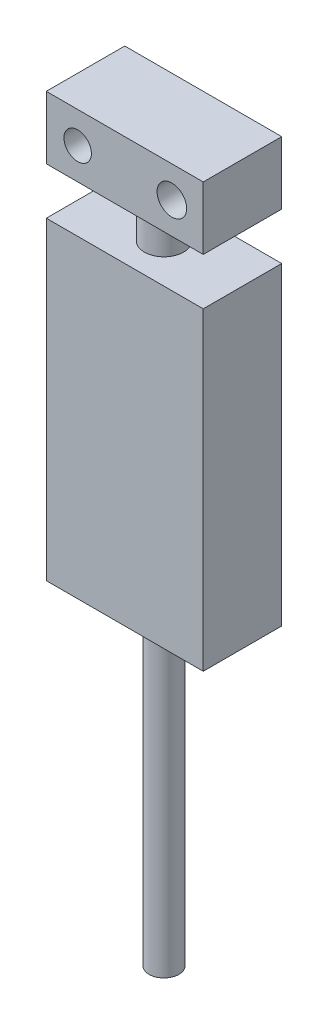
ISO-10303-21;
HEADER;
FILE_DESCRIPTION(('STEP AP214'),'2;1');
FILE_NAME('part.step','',(''),(''),'','','');
FILE_SCHEMA(('AUTOMOTIVE_DESIGN { 1 0 10303 214 1 1 1 1 }'));
ENDSEC;
DATA;
#1=APPLICATION_CONTEXT('core data for automotive mechanical design processes');
#2=APPLICATION_PROTOCOL_DEFINITION('international standard','automotive_design',2000,#1);
#3=PRODUCT_CONTEXT('',#1,'mechanical');
#4=PRODUCT('Part','Part','',(#3));
#5=PRODUCT_RELATED_PRODUCT_CATEGORY('part','',(#4));
#6=PRODUCT_DEFINITION_FORMATION('','',#4);
#7=PRODUCT_DEFINITION_CONTEXT('part definition',#1,'design');
#8=PRODUCT_DEFINITION('design','',#6,#7);
#9=PRODUCT_DEFINITION_SHAPE('','',#8);
#10=(LENGTH_UNIT() NAMED_UNIT(*) SI_UNIT(.MILLI.,.METRE.));
#11=(NAMED_UNIT(*) PLANE_ANGLE_UNIT() SI_UNIT($,.RADIAN.));
#12=(NAMED_UNIT(*) SI_UNIT($,.STERADIAN.) SOLID_ANGLE_UNIT());
#13=UNCERTAINTY_MEASURE_WITH_UNIT(LENGTH_MEASURE(1.E-05),#10,'distance_accuracy_value','');
#14=(GEOMETRIC_REPRESENTATION_CONTEXT(3) GLOBAL_UNCERTAINTY_ASSIGNED_CONTEXT((#13)) GLOBAL_UNIT_ASSIGNED_CONTEXT((#10,
#11,#12)) REPRESENTATION_CONTEXT('',''));
#15=CARTESIAN_POINT('',(0.,0.,0.));
#16=DIRECTION('',(0.,0.,1.));
#17=DIRECTION('',(1.,0.,0.));
#18=AXIS2_PLACEMENT_3D('',#15,#16,#17);
#19=CARTESIAN_POINT('',(100.,200.,100.));
#20=DIRECTION('',(-1.,0.,0.));
#21=DIRECTION('',(0.,-1.,0.));
#22=AXIS2_PLACEMENT_3D('',#19,#20,#21);
#23=PLANE('',#22);
#24=DIRECTION('',(0.,1.,0.));
#25=VECTOR('',#24,1.);
#26=CARTESIAN_POINT('',(100.,200.,0.));
#27=LINE('',#26,#25);
#28=CARTESIAN_POINT('',(100.,-200.,0.));
#29=VERTEX_POINT('',#28);
#30=CARTESIAN_POINT('',(100.,200.,0.));
#31=VERTEX_POINT('',#30);
#32=EDGE_CURVE('E140',#29,#31,#27,.T.);
#33=ORIENTED_EDGE('',*,*,#32,.T.);
#34=DIRECTION('',(0.,0.,-1.));
#35=VECTOR('',#34,1.);
#36=CARTESIAN_POINT('',(100.,200.,100.));
#37=LINE('',#36,#35);
#38=CARTESIAN_POINT('',(100.,200.,100.));
#39=VERTEX_POINT('',#38);
#40=EDGE_CURVE('E150',#39,#31,#37,.T.);
#41=ORIENTED_EDGE('',*,*,#40,.F.);
#42=DIRECTION('',(0.,1.,0.));
#43=VECTOR('',#42,1.);
#44=CARTESIAN_POINT('',(100.,200.,100.));
#45=LINE('',#44,#43);
#46=CARTESIAN_POINT('',(100.,-200.,100.));
#47=VERTEX_POINT('',#46);
#48=EDGE_CURVE('E151',#47,#39,#45,.T.);
#49=ORIENTED_EDGE('',*,*,#48,.F.);
#50=DIRECTION('',(0.,0.,-1.));
#51=VECTOR('',#50,1.);
#52=CARTESIAN_POINT('',(100.,-200.,100.));
#53=LINE('',#52,#51);
#54=EDGE_CURVE('E157',#47,#29,#53,.T.);
#55=ORIENTED_EDGE('',*,*,#54,.T.);
#56=EDGE_LOOP('',(#33,#41,#49,#55));
#57=FACE_BOUND('',#56,.T.);
#58=ADVANCED_FACE('F37',(#57),#23,.F.);
#59=CARTESIAN_POINT('',(-100.,200.,100.));
#60=DIRECTION('',(0.,-1.,0.));
#61=DIRECTION('',(0.,0.,-1.));
#62=AXIS2_PLACEMENT_3D('',#59,#60,#61);
#63=PLANE('',#62);
#64=CARTESIAN_POINT('',(0.,200.,50.));
#65=DIRECTION('',(0.,1.,0.));
#66=DIRECTION('',(0.,0.,1.));
#67=AXIS2_PLACEMENT_3D('',#64,#65,#66);
#68=CIRCLE('',#67,25.);
#69=CARTESIAN_POINT('',(0.,200.,25.));
#70=VERTEX_POINT('',#69);
#71=EDGE_CURVE('E146',#70,#70,#68,.T.);
#72=ORIENTED_EDGE('',*,*,#71,.F.);
#73=EDGE_LOOP('',(#72));
#74=FACE_BOUND('',#73,.T.);
#75=DIRECTION('',(-1.,0.,0.));
#76=VECTOR('',#75,1.);
#77=CARTESIAN_POINT('',(-100.,200.,0.));
#78=LINE('',#77,#76);
#79=CARTESIAN_POINT('',(-100.,200.,0.));
#80=VERTEX_POINT('',#79);
#81=EDGE_CURVE('E160',#31,#80,#78,.T.);
#82=ORIENTED_EDGE('',*,*,#81,.T.);
#83=DIRECTION('',(0.,0.,-1.));
#84=VECTOR('',#83,1.);
#85=CARTESIAN_POINT('',(-100.,200.,100.));
#86=LINE('',#85,#84);
#87=CARTESIAN_POINT('',(-100.,200.,100.));
#88=VERTEX_POINT('',#87);
#89=EDGE_CURVE('E167',#88,#80,#86,.T.);
#90=ORIENTED_EDGE('',*,*,#89,.F.);
#91=DIRECTION('',(-1.,0.,0.));
#92=VECTOR('',#91,1.);
#93=CARTESIAN_POINT('',(-100.,200.,100.));
#94=LINE('',#93,#92);
#95=EDGE_CURVE('E85',#39,#88,#94,.T.);
#96=ORIENTED_EDGE('',*,*,#95,.F.);
#97=ORIENTED_EDGE('',*,*,#40,.T.);
#98=EDGE_LOOP('',(#82,#90,#96,#97));
#99=FACE_BOUND('',#98,.T.);
#100=ADVANCED_FACE('F193',(#74,#99),#63,.F.);
#101=CARTESIAN_POINT('',(-100.,200.,100.));
#102=DIRECTION('',(1.,0.,0.));
#103=DIRECTION('',(0.,1.,0.));
#104=AXIS2_PLACEMENT_3D('',#101,#102,#103);
#105=PLANE('',#104);
#106=DIRECTION('',(0.,-1.,0.));
#107=VECTOR('',#106,1.);
#108=CARTESIAN_POINT('',(-100.,200.,0.));
#109=LINE('',#108,#107);
#110=CARTESIAN_POINT('',(-100.,-200.,0.));
#111=VERTEX_POINT('',#110);
#112=EDGE_CURVE('E71',#80,#111,#109,.T.);
#113=ORIENTED_EDGE('',*,*,#112,.T.);
#114=DIRECTION('',(0.,0.,-1.));
#115=VECTOR('',#114,1.);
#116=CARTESIAN_POINT('',(-100.,-200.,100.));
#117=LINE('',#116,#115);
#118=CARTESIAN_POINT('',(-100.,-200.,100.));
#119=VERTEX_POINT('',#118);
#120=EDGE_CURVE('E165',#119,#111,#117,.T.);
#121=ORIENTED_EDGE('',*,*,#120,.F.);
#122=DIRECTION('',(0.,-1.,0.));
#123=VECTOR('',#122,1.);
#124=CARTESIAN_POINT('',(-100.,200.,100.));
#125=LINE('',#124,#123);
#126=EDGE_CURVE('E154',#88,#119,#125,.T.);
#127=ORIENTED_EDGE('',*,*,#126,.F.);
#128=ORIENTED_EDGE('',*,*,#89,.T.);
#129=EDGE_LOOP('',(#113,#121,#127,#128));
#130=FACE_BOUND('',#129,.T.);
#131=ADVANCED_FACE('F192',(#130),#105,.F.);
#132=CARTESIAN_POINT('',(-100.,-200.,100.));
#133=DIRECTION('',(0.,1.,0.));
#134=DIRECTION('',(0.,0.,1.));
#135=AXIS2_PLACEMENT_3D('',#132,#133,#134);
#136=PLANE('',#135);
#137=CARTESIAN_POINT('',(0.,-200.,50.));
#138=DIRECTION('',(0.,-1.,0.));
#139=DIRECTION('',(0.,0.,-1.));
#140=AXIS2_PLACEMENT_3D('',#137,#138,#139);
#141=CIRCLE('',#140,19.);
#142=CARTESIAN_POINT('',(0.,-200.,31.));
#143=VERTEX_POINT('',#142);
#144=EDGE_CURVE('E149',#143,#143,#141,.T.);
#145=ORIENTED_EDGE('',*,*,#144,.F.);
#146=EDGE_LOOP('',(#145));
#147=FACE_BOUND('',#146,.T.);
#148=DIRECTION('',(1.,0.,0.));
#149=VECTOR('',#148,1.);
#150=CARTESIAN_POINT('',(-100.,-200.,0.));
#151=LINE('',#150,#149);
#152=EDGE_CURVE('E77',#111,#29,#151,.T.);
#153=ORIENTED_EDGE('',*,*,#152,.T.);
#154=ORIENTED_EDGE('',*,*,#54,.F.);
#155=DIRECTION('',(1.,0.,0.));
#156=VECTOR('',#155,1.);
#157=CARTESIAN_POINT('',(-100.,-200.,100.));
#158=LINE('',#157,#156);
#159=EDGE_CURVE('E53',#119,#47,#158,.T.);
#160=ORIENTED_EDGE('',*,*,#159,.F.);
#161=ORIENTED_EDGE('',*,*,#120,.T.);
#162=EDGE_LOOP('',(#153,#154,#160,#161));
#163=FACE_BOUND('',#162,.T.);
#164=ADVANCED_FACE('F190',(#147,#163),#136,.F.);
#165=CARTESIAN_POINT('',(0.,0.,100.));
#166=DIRECTION('',(0.,0.,1.));
#167=DIRECTION('',(1.,0.,0.));
#168=AXIS2_PLACEMENT_3D('',#165,#166,#167);
#169=PLANE('',#168);
#170=ORIENTED_EDGE('',*,*,#48,.T.);
#171=ORIENTED_EDGE('',*,*,#95,.T.);
#172=ORIENTED_EDGE('',*,*,#126,.T.);
#173=ORIENTED_EDGE('',*,*,#159,.T.);
#174=EDGE_LOOP('',(#170,#171,#172,#173));
#175=FACE_BOUND('',#174,.T.);
#176=ADVANCED_FACE('F181',(#175),#169,.T.);
#177=CARTESIAN_POINT('',(0.,0.,0.));
#178=DIRECTION('',(0.,0.,1.));
#179=DIRECTION('',(1.,0.,0.));
#180=AXIS2_PLACEMENT_3D('',#177,#178,#179);
#181=PLANE('',#180);
#182=CARTESIAN_POINT('',(-40.,-65.,0.));
#183=DIRECTION('',(0.,0.,1.));
#184=DIRECTION('',(1.,0.,0.));
#185=AXIS2_PLACEMENT_3D('',#182,#183,#184);
#186=CIRCLE('',#185,9.99999999999999);
#187=CARTESIAN_POINT('',(-30.,-65.,0.));
#188=VERTEX_POINT('',#187);
#189=EDGE_CURVE('E11',#188,#188,#186,.F.);
#190=ORIENTED_EDGE('',*,*,#189,.F.);
#191=EDGE_LOOP('',(#190));
#192=FACE_BOUND('',#191,.T.);
#193=CARTESIAN_POINT('',(20.,-65.,0.));
#194=DIRECTION('',(0.,0.,1.));
#195=DIRECTION('',(1.,0.,0.));
#196=AXIS2_PLACEMENT_3D('',#193,#194,#195);
#197=CIRCLE('',#196,10.);
#198=CARTESIAN_POINT('',(30.,-65.,0.));
#199=VERTEX_POINT('',#198);
#200=EDGE_CURVE('E45',#199,#199,#197,.F.);
#201=ORIENTED_EDGE('',*,*,#200,.F.);
#202=EDGE_LOOP('',(#201));
#203=FACE_BOUND('',#202,.T.);
#204=CARTESIAN_POINT('',(0.,175.,0.));
#205=DIRECTION('',(0.,0.,1.));
#206=DIRECTION('',(1.,0.,0.));
#207=AXIS2_PLACEMENT_3D('',#204,#205,#206);
#208=CIRCLE('',#207,10.);
#209=CARTESIAN_POINT('',(10.,175.,0.));
#210=VERTEX_POINT('',#209);
#211=EDGE_CURVE('E170',#210,#210,#208,.F.);
#212=ORIENTED_EDGE('',*,*,#211,.F.);
#213=EDGE_LOOP('',(#212));
#214=FACE_BOUND('',#213,.T.);
#215=ORIENTED_EDGE('',*,*,#32,.F.);
#216=ORIENTED_EDGE('',*,*,#152,.F.);
#217=ORIENTED_EDGE('',*,*,#112,.F.);
#218=ORIENTED_EDGE('',*,*,#81,.F.);
#219=EDGE_LOOP('',(#215,#216,#217,#218));
#220=FACE_BOUND('',#219,.T.);
#221=ADVANCED_FACE('F177',(#192,#203,#214,#220),#181,.F.);
#222=CARTESIAN_POINT('',(0.,260.,50.));
#223=DIRECTION('',(0.,-1.,0.));
#224=DIRECTION('',(0.,0.,-1.));
#225=AXIS2_PLACEMENT_3D('',#222,#223,#224);
#226=CYLINDRICAL_SURFACE('',#225,25.);
#227=CARTESIAN_POINT('',(0.,260.,50.));
#228=DIRECTION('',(0.,1.,0.));
#229=DIRECTION('',(0.,0.,1.));
#230=AXIS2_PLACEMENT_3D('',#227,#228,#229);
#231=CIRCLE('',#230,25.);
#232=CARTESIAN_POINT('',(0.,260.,25.));
#233=VERTEX_POINT('',#232);
#234=EDGE_CURVE('E137',#233,#233,#231,.T.);
#235=CARTESIAN_POINT('',(0.,260.,25.));
#236=CARTESIAN_POINT('',(0.,259.375,25.));
#237=CARTESIAN_POINT('',(0.,258.75,25.));
#238=CARTESIAN_POINT('',(0.,257.5,25.));
#239=CARTESIAN_POINT('',(0.,256.875,25.));
#240=CARTESIAN_POINT('',(0.,255.625,25.));
#241=CARTESIAN_POINT('',(0.,255.,25.));
#242=CARTESIAN_POINT('',(0.,253.75,25.));
#243=CARTESIAN_POINT('',(0.,253.125,25.));
#244=CARTESIAN_POINT('',(0.,251.875,25.));
#245=CARTESIAN_POINT('',(0.,251.25,25.));
#246=CARTESIAN_POINT('',(0.,250.,25.));
#247=CARTESIAN_POINT('',(0.,249.375,25.));
#248=CARTESIAN_POINT('',(0.,248.125,25.));
#249=CARTESIAN_POINT('',(0.,247.5,25.));
#250=CARTESIAN_POINT('',(0.,246.25,25.));
#251=CARTESIAN_POINT('',(0.,245.625,25.));
#252=CARTESIAN_POINT('',(0.,244.375,25.));
#253=CARTESIAN_POINT('',(0.,243.75,25.));
#254=CARTESIAN_POINT('',(0.,242.5,25.));
#255=CARTESIAN_POINT('',(0.,241.875,25.));
#256=CARTESIAN_POINT('',(0.,240.625,25.));
#257=CARTESIAN_POINT('',(0.,240.,25.));
#258=CARTESIAN_POINT('',(0.,238.75,25.));
#259=CARTESIAN_POINT('',(0.,238.125,25.));
#260=CARTESIAN_POINT('',(0.,236.875,25.));
#261=CARTESIAN_POINT('',(0.,236.25,25.));
#262=CARTESIAN_POINT('',(0.,235.,25.));
#263=CARTESIAN_POINT('',(0.,234.375,25.));
#264=CARTESIAN_POINT('',(0.,233.125,25.));
#265=CARTESIAN_POINT('',(0.,232.5,25.));
#266=CARTESIAN_POINT('',(0.,231.25,25.));
#267=CARTESIAN_POINT('',(0.,230.625,25.));
#268=CARTESIAN_POINT('',(0.,229.375,25.));
#269=CARTESIAN_POINT('',(0.,228.75,25.));
#270=CARTESIAN_POINT('',(0.,227.5,25.));
#271=CARTESIAN_POINT('',(0.,226.875,25.));
#272=CARTESIAN_POINT('',(0.,225.625,25.));
#273=CARTESIAN_POINT('',(0.,225.,25.));
#274=CARTESIAN_POINT('',(0.,223.75,25.));
#275=CARTESIAN_POINT('',(0.,223.125,25.));
#276=CARTESIAN_POINT('',(0.,221.875,25.));
#277=CARTESIAN_POINT('',(0.,221.25,25.));
#278=CARTESIAN_POINT('',(0.,220.,25.));
#279=CARTESIAN_POINT('',(0.,219.375,25.));
#280=CARTESIAN_POINT('',(0.,218.125,25.));
#281=CARTESIAN_POINT('',(0.,217.5,25.));
#282=CARTESIAN_POINT('',(0.,216.25,25.));
#283=CARTESIAN_POINT('',(0.,215.625,25.));
#284=CARTESIAN_POINT('',(0.,214.375,25.));
#285=CARTESIAN_POINT('',(0.,213.75,25.));
#286=CARTESIAN_POINT('',(0.,212.5,25.));
#287=CARTESIAN_POINT('',(0.,211.875,25.));
#288=CARTESIAN_POINT('',(0.,210.625,25.));
#289=CARTESIAN_POINT('',(0.,210.,25.));
#290=CARTESIAN_POINT('',(0.,208.75,25.));
#291=CARTESIAN_POINT('',(0.,208.125,25.));
#292=CARTESIAN_POINT('',(0.,206.875,25.));
#293=CARTESIAN_POINT('',(0.,206.25,25.));
#294=CARTESIAN_POINT('',(0.,205.,25.));
#295=CARTESIAN_POINT('',(0.,204.375,25.));
#296=CARTESIAN_POINT('',(0.,203.125,25.));
#297=CARTESIAN_POINT('',(0.,202.5,25.));
#298=CARTESIAN_POINT('',(0.,201.25,25.));
#299=CARTESIAN_POINT('',(0.,200.625,25.));
#300=CARTESIAN_POINT('',(0.,200.,25.));
#301=B_SPLINE_CURVE_WITH_KNOTS('',3,(#235,#236,#237,#238,#239,#240,#241,#242,#243,#244,#245,
#246,#247,#248,#249,#250,#251,#252,#253,#254,#255,#256,#257,#258,#259,#260,#261,#262,#263,#264,
#265,#266,#267,#268,#269,#270,#271,#272,#273,#274,#275,#276,#277,#278,#279,#280,#281,#282,#283,
#284,#285,#286,#287,#288,#289,#290,#291,#292,#293,#294,#295,#296,#297,#298,#299,#300),
.UNSPECIFIED.,.F.,.F.,(4,2,2,2,2,2,2,2,2,2,2,2,2,2,2,2,2,2,2,2,2,2,2,2,2,2,2,2,2,2,2,2,4),(0.,
1.87500000000002,3.75000000000003,5.62500000000005,7.50000000000001,9.37500000000002,11.25,
13.125,15.,16.875,18.75,20.625,22.5,24.375,26.25,28.125,30.,31.875,33.75,35.625,37.5,39.375,
41.25,43.125,45.,46.875,48.75,50.625,52.5,54.375,56.25,58.125,60.),.UNSPECIFIED.);
#302=EDGE_CURVE('BSEAM180',#233,#70,#301,.T.);
#303=ORIENTED_EDGE('',*,*,#234,.F.);
#304=ORIENTED_EDGE('',*,*,#71,.T.);
#305=ORIENTED_EDGE('',*,*,#302,.T.);
#306=ORIENTED_EDGE('',*,*,#302,.F.);
#307=EDGE_LOOP('',(#303,#305,#304,#306));
#308=FACE_BOUND('',#307,.T.);
#309=ADVANCED_FACE('F180',(#308),#226,.T.);
#310=CARTESIAN_POINT('',(-100.,340.,0.));
#311=DIRECTION('',(1.,0.,0.));
#312=DIRECTION('',(0.,0.,-1.));
#313=AXIS2_PLACEMENT_3D('',#310,#311,#312);
#314=PLANE('',#313);
#315=DIRECTION('',(0.,0.,1.));
#316=VECTOR('',#315,1.);
#317=CARTESIAN_POINT('',(-100.,260.,0.));
#318=LINE('',#317,#316);
#319=CARTESIAN_POINT('',(-100.,260.,0.));
#320=VERTEX_POINT('',#319);
#321=CARTESIAN_POINT('',(-100.,260.,100.));
#322=VERTEX_POINT('',#321);
#323=EDGE_CURVE('E136',#320,#322,#318,.T.);
#324=ORIENTED_EDGE('',*,*,#323,.T.);
#325=DIRECTION('',(0.,-1.,0.));
#326=VECTOR('',#325,1.);
#327=CARTESIAN_POINT('',(-100.,340.,100.));
#328=LINE('',#327,#326);
#329=CARTESIAN_POINT('',(-100.,340.,100.));
#330=VERTEX_POINT('',#329);
#331=EDGE_CURVE('E116',#330,#322,#328,.T.);
#332=ORIENTED_EDGE('',*,*,#331,.F.);
#333=DIRECTION('',(0.,0.,1.));
#334=VECTOR('',#333,1.);
#335=CARTESIAN_POINT('',(-100.,340.,0.));
#336=LINE('',#335,#334);
#337=CARTESIAN_POINT('',(-100.,340.,0.));
#338=VERTEX_POINT('',#337);
#339=EDGE_CURVE('E123',#338,#330,#336,.T.);
#340=ORIENTED_EDGE('',*,*,#339,.F.);
#341=DIRECTION('',(0.,-1.,0.));
#342=VECTOR('',#341,1.);
#343=CARTESIAN_POINT('',(-100.,340.,0.));
#344=LINE('',#343,#342);
#345=EDGE_CURVE('E310',#338,#320,#344,.T.);
#346=ORIENTED_EDGE('',*,*,#345,.T.);
#347=EDGE_LOOP('',(#324,#332,#340,#346));
#348=FACE_BOUND('',#347,.T.);
#349=ADVANCED_FACE('F134',(#348),#314,.F.);
#350=CARTESIAN_POINT('',(-100.,340.,100.));
#351=DIRECTION('',(0.,0.,-1.));
#352=DIRECTION('',(-1.,0.,0.));
#353=AXIS2_PLACEMENT_3D('',#350,#351,#352);
#354=PLANE('',#353);
#355=CARTESIAN_POINT('',(-60.,300.,100.));
#356=DIRECTION('',(0.,0.,1.));
#357=DIRECTION('',(1.,0.,0.));
#358=AXIS2_PLACEMENT_3D('',#355,#356,#357);
#359=CIRCLE('',#358,17.5);
#360=CARTESIAN_POINT('',(-42.5,300.,100.));
#361=VERTEX_POINT('',#360);
#362=EDGE_CURVE('E300',#361,#361,#359,.T.);
#363=ORIENTED_EDGE('',*,*,#362,.F.);
#364=EDGE_LOOP('',(#363));
#365=FACE_BOUND('',#364,.T.);
#366=CARTESIAN_POINT('',(60.,300.,100.));
#367=DIRECTION('',(0.,0.,1.));
#368=DIRECTION('',(1.,0.,0.));
#369=AXIS2_PLACEMENT_3D('',#366,#367,#368);
#370=CIRCLE('',#369,18.8266671896297);
#371=CARTESIAN_POINT('',(78.8266671896296,300.,100.));
#372=VERTEX_POINT('',#371);
#373=EDGE_CURVE('E303',#372,#372,#370,.T.);
#374=ORIENTED_EDGE('',*,*,#373,.F.);
#375=EDGE_LOOP('',(#374));
#376=FACE_BOUND('',#375,.T.);
#377=DIRECTION('',(1.,0.,0.));
#378=VECTOR('',#377,1.);
#379=CARTESIAN_POINT('',(-100.,260.,100.));
#380=LINE('',#379,#378);
#381=CARTESIAN_POINT('',(100.,260.,100.));
#382=VERTEX_POINT('',#381);
#383=EDGE_CURVE('E312',#322,#382,#380,.T.);
#384=ORIENTED_EDGE('',*,*,#383,.T.);
#385=DIRECTION('',(0.,-1.,0.));
#386=VECTOR('',#385,1.);
#387=CARTESIAN_POINT('',(100.,340.,100.));
#388=LINE('',#387,#386);
#389=CARTESIAN_POINT('',(100.,340.,100.));
#390=VERTEX_POINT('',#389);
#391=EDGE_CURVE('E119',#390,#382,#388,.T.);
#392=ORIENTED_EDGE('',*,*,#391,.F.);
#393=DIRECTION('',(1.,0.,0.));
#394=VECTOR('',#393,1.);
#395=CARTESIAN_POINT('',(-100.,340.,100.));
#396=LINE('',#395,#394);
#397=EDGE_CURVE('E112',#330,#390,#396,.T.);
#398=ORIENTED_EDGE('',*,*,#397,.F.);
#399=ORIENTED_EDGE('',*,*,#331,.T.);
#400=EDGE_LOOP('',(#384,#392,#398,#399));
#401=FACE_BOUND('',#400,.T.);
#402=ADVANCED_FACE('F114',(#365,#376,#401),#354,.F.);
#403=CARTESIAN_POINT('',(100.,340.,0.));
#404=DIRECTION('',(-1.,0.,0.));
#405=DIRECTION('',(0.,0.,1.));
#406=AXIS2_PLACEMENT_3D('',#403,#404,#405);
#407=PLANE('',#406);
#408=DIRECTION('',(0.,0.,-1.));
#409=VECTOR('',#408,1.);
#410=CARTESIAN_POINT('',(100.,260.,0.));
#411=LINE('',#410,#409);
#412=CARTESIAN_POINT('',(100.,260.,0.));
#413=VERTEX_POINT('',#412);
#414=EDGE_CURVE('E314',#382,#413,#411,.T.);
#415=ORIENTED_EDGE('',*,*,#414,.T.);
#416=DIRECTION('',(0.,-1.,0.));
#417=VECTOR('',#416,1.);
#418=CARTESIAN_POINT('',(100.,340.,0.));
#419=LINE('',#418,#417);
#420=CARTESIAN_POINT('',(100.,340.,0.));
#421=VERTEX_POINT('',#420);
#422=EDGE_CURVE('E142',#421,#413,#419,.T.);
#423=ORIENTED_EDGE('',*,*,#422,.F.);
#424=DIRECTION('',(0.,0.,-1.));
#425=VECTOR('',#424,1.);
#426=CARTESIAN_POINT('',(100.,340.,0.));
#427=LINE('',#426,#425);
#428=EDGE_CURVE('E122',#390,#421,#427,.T.);
#429=ORIENTED_EDGE('',*,*,#428,.F.);
#430=ORIENTED_EDGE('',*,*,#391,.T.);
#431=EDGE_LOOP('',(#415,#423,#429,#430));
#432=FACE_BOUND('',#431,.T.);
#433=ADVANCED_FACE('F215',(#432),#407,.F.);
#434=CARTESIAN_POINT('',(-100.,340.,0.));
#435=DIRECTION('',(0.,0.,1.));
#436=DIRECTION('',(1.,0.,0.));
#437=AXIS2_PLACEMENT_3D('',#434,#435,#436);
#438=PLANE('',#437);
#439=DIRECTION('',(-1.,0.,0.));
#440=VECTOR('',#439,1.);
#441=CARTESIAN_POINT('',(-100.,260.,0.));
#442=LINE('',#441,#440);
#443=EDGE_CURVE('E132',#413,#320,#442,.T.);
#444=ORIENTED_EDGE('',*,*,#443,.T.);
#445=ORIENTED_EDGE('',*,*,#345,.F.);
#446=DIRECTION('',(-1.,0.,0.));
#447=VECTOR('',#446,1.);
#448=CARTESIAN_POINT('',(-100.,340.,0.));
#449=LINE('',#448,#447);
#450=EDGE_CURVE('E128',#421,#338,#449,.T.);
#451=ORIENTED_EDGE('',*,*,#450,.F.);
#452=ORIENTED_EDGE('',*,*,#422,.T.);
#453=EDGE_LOOP('',(#444,#445,#451,#452));
#454=FACE_BOUND('',#453,.T.);
#455=ADVANCED_FACE('F219',(#454),#438,.F.);
#456=CARTESIAN_POINT('',(0.,340.,0.));
#457=DIRECTION('',(0.,1.,0.));
#458=DIRECTION('',(0.,0.,1.));
#459=AXIS2_PLACEMENT_3D('',#456,#457,#458);
#460=PLANE('',#459);
#461=ORIENTED_EDGE('',*,*,#339,.T.);
#462=ORIENTED_EDGE('',*,*,#397,.T.);
#463=ORIENTED_EDGE('',*,*,#428,.T.);
#464=ORIENTED_EDGE('',*,*,#450,.T.);
#465=EDGE_LOOP('',(#461,#462,#463,#464));
#466=FACE_BOUND('',#465,.T.);
#467=ADVANCED_FACE('F126',(#466),#460,.T.);
#468=CARTESIAN_POINT('',(0.,260.,0.));
#469=DIRECTION('',(0.,1.,0.));
#470=DIRECTION('',(0.,0.,1.));
#471=AXIS2_PLACEMENT_3D('',#468,#469,#470);
#472=PLANE('',#471);
#473=ORIENTED_EDGE('',*,*,#234,.T.);
#474=EDGE_LOOP('',(#473));
#475=FACE_BOUND('',#474,.T.);
#476=ORIENTED_EDGE('',*,*,#323,.F.);
#477=ORIENTED_EDGE('',*,*,#443,.F.);
#478=ORIENTED_EDGE('',*,*,#414,.F.);
#479=ORIENTED_EDGE('',*,*,#383,.F.);
#480=EDGE_LOOP('',(#476,#477,#478,#479));
#481=FACE_BOUND('',#480,.T.);
#482=ADVANCED_FACE('F224',(#475,#481),#472,.F.);
#483=CARTESIAN_POINT('',(60.,300.,60.));
#484=DIRECTION('',(0.,0.,1.));
#485=DIRECTION('',(1.,0.,0.));
#486=AXIS2_PLACEMENT_3D('',#483,#484,#485);
#487=CYLINDRICAL_SURFACE('',#486,18.8266671896297);
#488=CARTESIAN_POINT('',(60.,300.,60.));
#489=DIRECTION('',(0.,0.,1.));
#490=DIRECTION('',(1.,0.,0.));
#491=AXIS2_PLACEMENT_3D('',#488,#489,#490);
#492=CIRCLE('',#491,18.8266671896297);
#493=CARTESIAN_POINT('',(78.8266671896296,300.,60.));
#494=VERTEX_POINT('',#493);
#495=EDGE_CURVE('E294',#494,#494,#492,.T.);
#496=ORIENTED_EDGE('',*,*,#495,.F.);
#497=EDGE_LOOP('',(#496));
#498=FACE_BOUND('',#497,.T.);
#499=ORIENTED_EDGE('',*,*,#373,.T.);
#500=EDGE_LOOP('',(#499));
#501=FACE_BOUND('',#500,.T.);
#502=ADVANCED_FACE('F227',(#498,#501),#487,.F.);
#503=CARTESIAN_POINT('',(60.,300.,60.));
#504=DIRECTION('',(0.,0.,1.));
#505=DIRECTION('',(1.,0.,0.));
#506=AXIS2_PLACEMENT_3D('',#503,#504,#505);
#507=PLANE('',#506);
#508=ORIENTED_EDGE('',*,*,#495,.T.);
#509=EDGE_LOOP('',(#508));
#510=FACE_BOUND('',#509,.T.);
#511=ADVANCED_FACE('F231',(#510),#507,.T.);
#512=CARTESIAN_POINT('',(-60.,300.,60.));
#513=DIRECTION('',(0.,0.,1.));
#514=DIRECTION('',(1.,0.,0.));
#515=AXIS2_PLACEMENT_3D('',#512,#513,#514);
#516=CYLINDRICAL_SURFACE('',#515,17.5);
#517=CARTESIAN_POINT('',(-60.,300.,60.));
#518=DIRECTION('',(0.,0.,1.));
#519=DIRECTION('',(1.,0.,0.));
#520=AXIS2_PLACEMENT_3D('',#517,#518,#519);
#521=CIRCLE('',#520,17.5);
#522=CARTESIAN_POINT('',(-42.5,300.,60.));
#523=VERTEX_POINT('',#522);
#524=EDGE_CURVE('E297',#523,#523,#521,.T.);
#525=ORIENTED_EDGE('',*,*,#524,.F.);
#526=EDGE_LOOP('',(#525));
#527=FACE_BOUND('',#526,.T.);
#528=ORIENTED_EDGE('',*,*,#362,.T.);
#529=EDGE_LOOP('',(#528));
#530=FACE_BOUND('',#529,.T.);
#531=ADVANCED_FACE('F234',(#527,#530),#516,.F.);
#532=CARTESIAN_POINT('',(-60.,300.,60.));
#533=DIRECTION('',(0.,0.,1.));
#534=DIRECTION('',(1.,0.,0.));
#535=AXIS2_PLACEMENT_3D('',#532,#533,#534);
#536=PLANE('',#535);
#537=ORIENTED_EDGE('',*,*,#524,.T.);
#538=EDGE_LOOP('',(#537));
#539=FACE_BOUND('',#538,.T.);
#540=ADVANCED_FACE('F241',(#539),#536,.T.);
#541=CARTESIAN_POINT('',(0.,-600.,50.));
#542=DIRECTION('',(0.,1.,0.));
#543=DIRECTION('',(0.,0.,1.));
#544=AXIS2_PLACEMENT_3D('',#541,#542,#543);
#545=CYLINDRICAL_SURFACE('',#544,19.);
#546=CARTESIAN_POINT('',(0.,-600.,50.));
#547=DIRECTION('',(0.,-1.,0.));
#548=DIRECTION('',(0.,0.,-1.));
#549=AXIS2_PLACEMENT_3D('',#546,#547,#548);
#550=CIRCLE('',#549,19.);
#551=CARTESIAN_POINT('',(0.,-600.,31.));
#552=VERTEX_POINT('',#551);
#553=EDGE_CURVE('E291',#552,#552,#550,.T.);
#554=ORIENTED_EDGE('',*,*,#553,.F.);
#555=EDGE_LOOP('',(#554));
#556=FACE_BOUND('',#555,.T.);
#557=ORIENTED_EDGE('',*,*,#144,.T.);
#558=EDGE_LOOP('',(#557));
#559=FACE_BOUND('',#558,.T.);
#560=ADVANCED_FACE('F245',(#556,#559),#545,.T.);
#561=CARTESIAN_POINT('',(0.,-600.,50.));
#562=DIRECTION('',(0.,-1.,0.));
#563=DIRECTION('',(0.,0.,-1.));
#564=AXIS2_PLACEMENT_3D('',#561,#562,#563);
#565=PLANE('',#564);
#566=ORIENTED_EDGE('',*,*,#553,.T.);
#567=EDGE_LOOP('',(#566));
#568=FACE_BOUND('',#567,.T.);
#569=ADVANCED_FACE('F249',(#568),#565,.T.);
#570=CARTESIAN_POINT('',(0.,175.,-15.));
#571=DIRECTION('',(0.,0.,1.));
#572=DIRECTION('',(1.,0.,0.));
#573=AXIS2_PLACEMENT_3D('',#570,#571,#572);
#574=CYLINDRICAL_SURFACE('',#573,10.);
#575=CARTESIAN_POINT('',(0.,175.,-15.));
#576=DIRECTION('',(0.,0.,-1.));
#577=DIRECTION('',(-1.,0.,0.));
#578=AXIS2_PLACEMENT_3D('',#575,#576,#577);
#579=CIRCLE('',#578,10.);
#580=CARTESIAN_POINT('',(-9.99999999999999,175.,-15.));
#581=VERTEX_POINT('',#580);
#582=EDGE_CURVE('E286',#581,#581,#579,.T.);
#583=ORIENTED_EDGE('',*,*,#582,.F.);
#584=EDGE_LOOP('',(#583));
#585=FACE_BOUND('',#584,.T.);
#586=ORIENTED_EDGE('',*,*,#211,.T.);
#587=EDGE_LOOP('',(#586));
#588=FACE_BOUND('',#587,.T.);
#589=ADVANCED_FACE('F253',(#585,#588),#574,.T.);
#590=CARTESIAN_POINT('',(0.,175.,-15.));
#591=DIRECTION('',(0.,0.,-1.));
#592=DIRECTION('',(-1.,0.,0.));
#593=AXIS2_PLACEMENT_3D('',#590,#591,#592);
#594=PLANE('',#593);
#595=ORIENTED_EDGE('',*,*,#582,.T.);
#596=EDGE_LOOP('',(#595));
#597=FACE_BOUND('',#596,.T.);
#598=ADVANCED_FACE('F257',(#597),#594,.T.);
#599=CARTESIAN_POINT('',(20.,-65.,-15.));
#600=DIRECTION('',(0.,0.,1.));
#601=DIRECTION('',(1.,0.,0.));
#602=AXIS2_PLACEMENT_3D('',#599,#600,#601);
#603=CYLINDRICAL_SURFACE('',#602,10.);
#604=CARTESIAN_POINT('',(20.,-65.,-15.));
#605=DIRECTION('',(0.,0.,-1.));
#606=DIRECTION('',(-1.,0.,0.));
#607=AXIS2_PLACEMENT_3D('',#604,#605,#606);
#608=CIRCLE('',#607,10.);
#609=CARTESIAN_POINT('',(9.99999999999996,-65.,-15.));
#610=VERTEX_POINT('',#609);
#611=EDGE_CURVE('E283',#610,#610,#608,.T.);
#612=ORIENTED_EDGE('',*,*,#611,.F.);
#613=EDGE_LOOP('',(#612));
#614=FACE_BOUND('',#613,.T.);
#615=ORIENTED_EDGE('',*,*,#200,.T.);
#616=EDGE_LOOP('',(#615));
#617=FACE_BOUND('',#616,.T.);
#618=ADVANCED_FACE('F175',(#614,#617),#603,.T.);
#619=CARTESIAN_POINT('',(20.,-65.,-15.));
#620=DIRECTION('',(0.,0.,-1.));
#621=DIRECTION('',(-1.,0.,0.));
#622=AXIS2_PLACEMENT_3D('',#619,#620,#621);
#623=PLANE('',#622);
#624=ORIENTED_EDGE('',*,*,#611,.T.);
#625=EDGE_LOOP('',(#624));
#626=FACE_BOUND('',#625,.T.);
#627=ADVANCED_FACE('F262',(#626),#623,.T.);
#628=CARTESIAN_POINT('',(-40.,-65.,-15.));
#629=DIRECTION('',(0.,0.,1.));
#630=DIRECTION('',(1.,0.,0.));
#631=AXIS2_PLACEMENT_3D('',#628,#629,#630);
#632=CYLINDRICAL_SURFACE('',#631,9.99999999999999);
#633=CARTESIAN_POINT('',(-40.,-65.,-15.));
#634=DIRECTION('',(0.,0.,-1.));
#635=DIRECTION('',(-1.,0.,0.));
#636=AXIS2_PLACEMENT_3D('',#633,#634,#635);
#637=CIRCLE('',#636,9.99999999999999);
#638=CARTESIAN_POINT('',(-50.,-65.,-15.));
#639=VERTEX_POINT('',#638);
#640=EDGE_CURVE('E281',#639,#639,#637,.T.);
#641=ORIENTED_EDGE('',*,*,#640,.F.);
#642=EDGE_LOOP('',(#641));
#643=FACE_BOUND('',#642,.T.);
#644=ORIENTED_EDGE('',*,*,#189,.T.);
#645=EDGE_LOOP('',(#644));
#646=FACE_BOUND('',#645,.T.);
#647=ADVANCED_FACE('F265',(#643,#646),#632,.T.);
#648=CARTESIAN_POINT('',(-40.,-65.,-15.));
#649=DIRECTION('',(0.,0.,-1.));
#650=DIRECTION('',(-1.,0.,0.));
#651=AXIS2_PLACEMENT_3D('',#648,#649,#650);
#652=PLANE('',#651);
#653=ORIENTED_EDGE('',*,*,#640,.T.);
#654=EDGE_LOOP('',(#653));
#655=FACE_BOUND('',#654,.T.);
#656=ADVANCED_FACE('F270',(#655),#652,.T.);
#657=CLOSED_SHELL('',(#58,#100,#131,#164,#176,#221,#309,#349,#402,#433,#455,#467,#482,#502,#511,
#531,#540,#560,#569,#589,#598,#618,#627,#647,#656));
#658=MANIFOLD_SOLID_BREP('B2',#657);
#659=ADVANCED_BREP_SHAPE_REPRESENTATION('',(#18,#658),#14);
#660=SHAPE_DEFINITION_REPRESENTATION(#9,#659);
ENDSEC;
END-ISO-10303-21;
